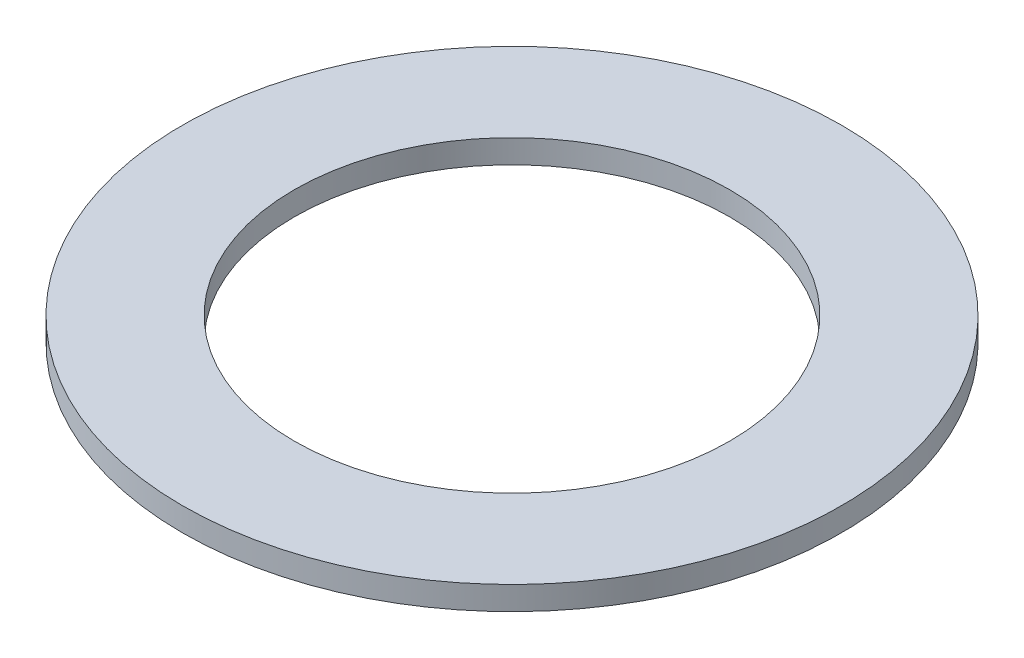
ISO-10303-21;
HEADER;
FILE_DESCRIPTION(('STEP AP214'),'2;1');
FILE_NAME('part.step','',(''),(''),'','','');
FILE_SCHEMA(('AUTOMOTIVE_DESIGN { 1 0 10303 214 1 1 1 1 }'));
ENDSEC;
DATA;
#1=APPLICATION_CONTEXT('core data for automotive mechanical design processes');
#2=APPLICATION_PROTOCOL_DEFINITION('international standard','automotive_design',2000,#1);
#3=PRODUCT_CONTEXT('',#1,'mechanical');
#4=PRODUCT('Part','Part','',(#3));
#5=PRODUCT_RELATED_PRODUCT_CATEGORY('part','',(#4));
#6=PRODUCT_DEFINITION_FORMATION('','',#4);
#7=PRODUCT_DEFINITION_CONTEXT('part definition',#1,'design');
#8=PRODUCT_DEFINITION('design','',#6,#7);
#9=PRODUCT_DEFINITION_SHAPE('','',#8);
#10=(LENGTH_UNIT() NAMED_UNIT(*) SI_UNIT(.MILLI.,.METRE.));
#11=(NAMED_UNIT(*) PLANE_ANGLE_UNIT() SI_UNIT($,.RADIAN.));
#12=(NAMED_UNIT(*) SI_UNIT($,.STERADIAN.) SOLID_ANGLE_UNIT());
#13=UNCERTAINTY_MEASURE_WITH_UNIT(LENGTH_MEASURE(1.E-05),#10,'distance_accuracy_value','');
#14=(GEOMETRIC_REPRESENTATION_CONTEXT(3) GLOBAL_UNCERTAINTY_ASSIGNED_CONTEXT((#13)) GLOBAL_UNIT_ASSIGNED_CONTEXT((#10,
#11,#12)) REPRESENTATION_CONTEXT('',''));
#15=CARTESIAN_POINT('',(0.,0.,0.));
#16=DIRECTION('',(0.,0.,1.));
#17=DIRECTION('',(1.,0.,0.));
#18=AXIS2_PLACEMENT_3D('',#15,#16,#17);
#19=CARTESIAN_POINT('',(0.,2.,0.));
#20=DIRECTION('',(0.,1.,0.));
#21=DIRECTION('',(0.,0.,1.));
#22=AXIS2_PLACEMENT_3D('',#19,#20,#21);
#23=PLANE('',#22);
#24=CARTESIAN_POINT('',(0.,2.,0.));
#25=DIRECTION('',(0.,1.,0.));
#26=DIRECTION('',(0.,0.,1.));
#27=AXIS2_PLACEMENT_3D('',#24,#25,#26);
#28=CIRCLE('',#27,28.);
#29=CARTESIAN_POINT('',(0.,2.,28.));
#30=VERTEX_POINT('',#29);
#31=EDGE_CURVE('E10',#30,#30,#28,.T.);
#32=ORIENTED_EDGE('',*,*,#31,.T.);
#33=EDGE_LOOP('',(#32));
#34=FACE_BOUND('',#33,.T.);
#35=CARTESIAN_POINT('',(0.,2.,0.));
#36=DIRECTION('',(0.,1.,0.));
#37=DIRECTION('',(0.,0.,1.));
#38=AXIS2_PLACEMENT_3D('',#35,#36,#37);
#39=CIRCLE('',#38,18.5);
#40=CARTESIAN_POINT('',(0.,2.,18.5));
#41=VERTEX_POINT('',#40);
#42=EDGE_CURVE('E50',#41,#41,#39,.T.);
#43=ORIENTED_EDGE('',*,*,#42,.F.);
#44=EDGE_LOOP('',(#43));
#45=FACE_BOUND('',#44,.T.);
#46=ADVANCED_FACE('F37',(#34,#45),#23,.T.);
#47=CARTESIAN_POINT('',(0.,0.,0.));
#48=DIRECTION('',(0.,1.,0.));
#49=DIRECTION('',(0.,0.,1.));
#50=AXIS2_PLACEMENT_3D('',#47,#48,#49);
#51=PLANE('',#50);
#52=CARTESIAN_POINT('',(0.,0.,0.));
#53=DIRECTION('',(0.,1.,0.));
#54=DIRECTION('',(0.,0.,1.));
#55=AXIS2_PLACEMENT_3D('',#52,#53,#54);
#56=CIRCLE('',#55,28.);
#57=CARTESIAN_POINT('',(0.,0.,28.));
#58=VERTEX_POINT('',#57);
#59=EDGE_CURVE('E41',#58,#58,#56,.T.);
#60=ORIENTED_EDGE('',*,*,#59,.F.);
#61=EDGE_LOOP('',(#60));
#62=FACE_BOUND('',#61,.T.);
#63=CARTESIAN_POINT('',(0.,0.,0.));
#64=DIRECTION('',(0.,1.,0.));
#65=DIRECTION('',(0.,0.,1.));
#66=AXIS2_PLACEMENT_3D('',#63,#64,#65);
#67=CIRCLE('',#66,18.5);
#68=CARTESIAN_POINT('',(0.,0.,18.5));
#69=VERTEX_POINT('',#68);
#70=EDGE_CURVE('E52',#69,#69,#67,.T.);
#71=ORIENTED_EDGE('',*,*,#70,.T.);
#72=EDGE_LOOP('',(#71));
#73=FACE_BOUND('',#72,.T.);
#74=ADVANCED_FACE('F64',(#62,#73),#51,.F.);
#75=CARTESIAN_POINT('',(0.,2.,0.));
#76=DIRECTION('',(0.,-1.,0.));
#77=DIRECTION('',(0.,0.,-1.));
#78=AXIS2_PLACEMENT_3D('',#75,#76,#77);
#79=CYLINDRICAL_SURFACE('',#78,28.);
#80=ORIENTED_EDGE('',*,*,#31,.F.);
#81=EDGE_LOOP('',(#80));
#82=FACE_BOUND('',#81,.T.);
#83=ORIENTED_EDGE('',*,*,#59,.T.);
#84=EDGE_LOOP('',(#83));
#85=FACE_BOUND('',#84,.T.);
#86=ADVANCED_FACE('F39',(#82,#85),#79,.T.);
#87=CARTESIAN_POINT('',(0.,2.,0.));
#88=DIRECTION('',(0.,-1.,0.));
#89=DIRECTION('',(0.,0.,-1.));
#90=AXIS2_PLACEMENT_3D('',#87,#88,#89);
#91=CYLINDRICAL_SURFACE('',#90,18.5);
#92=ORIENTED_EDGE('',*,*,#42,.T.);
#93=EDGE_LOOP('',(#92));
#94=FACE_BOUND('',#93,.T.);
#95=ORIENTED_EDGE('',*,*,#70,.F.);
#96=EDGE_LOOP('',(#95));
#97=FACE_BOUND('',#96,.T.);
#98=ADVANCED_FACE('F60',(#94,#97),#91,.F.);
#99=CLOSED_SHELL('',(#46,#74,#86,#98));
#100=MANIFOLD_SOLID_BREP('B2',#99);
#101=ADVANCED_BREP_SHAPE_REPRESENTATION('',(#18,#100),#14);
#102=SHAPE_DEFINITION_REPRESENTATION(#9,#101);
ENDSEC;
END-ISO-10303-21;
